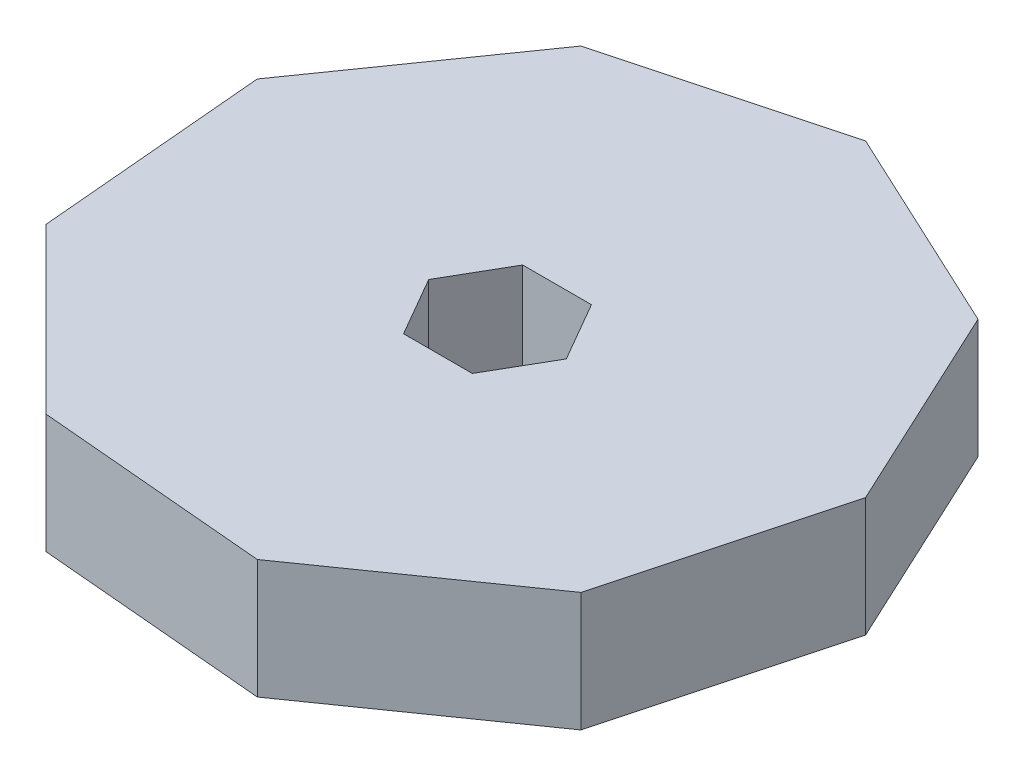
ISO-10303-21;
HEADER;
FILE_DESCRIPTION(('STEP AP214'),'2;1');
FILE_NAME('part.step','',(''),(''),'','','');
FILE_SCHEMA(('AUTOMOTIVE_DESIGN { 1 0 10303 214 1 1 1 1 }'));
ENDSEC;
DATA;
#1=APPLICATION_CONTEXT('core data for automotive mechanical design processes');
#2=APPLICATION_PROTOCOL_DEFINITION('international standard','automotive_design',2000,#1);
#3=PRODUCT_CONTEXT('',#1,'mechanical');
#4=PRODUCT('Part','Part','',(#3));
#5=PRODUCT_RELATED_PRODUCT_CATEGORY('part','',(#4));
#6=PRODUCT_DEFINITION_FORMATION('','',#4);
#7=PRODUCT_DEFINITION_CONTEXT('part definition',#1,'design');
#8=PRODUCT_DEFINITION('design','',#6,#7);
#9=PRODUCT_DEFINITION_SHAPE('','',#8);
#10=(LENGTH_UNIT() NAMED_UNIT(*) SI_UNIT(.MILLI.,.METRE.));
#11=(NAMED_UNIT(*) PLANE_ANGLE_UNIT() SI_UNIT($,.RADIAN.));
#12=(NAMED_UNIT(*) SI_UNIT($,.STERADIAN.) SOLID_ANGLE_UNIT());
#13=UNCERTAINTY_MEASURE_WITH_UNIT(LENGTH_MEASURE(1.E-05),#10,'distance_accuracy_value','');
#14=(GEOMETRIC_REPRESENTATION_CONTEXT(3) GLOBAL_UNCERTAINTY_ASSIGNED_CONTEXT((#13)) GLOBAL_UNIT_ASSIGNED_CONTEXT((#10,
#11,#12)) REPRESENTATION_CONTEXT('',''));
#15=CARTESIAN_POINT('',(0.,0.,0.));
#16=DIRECTION('',(0.,0.,1.));
#17=DIRECTION('',(1.,0.,0.));
#18=AXIS2_PLACEMENT_3D('',#15,#16,#17);
#19=CARTESIAN_POINT('',(4.68725880370433,6.35,17.4930880036489));
#20=DIRECTION('',(-0.573576436351048,0.,-0.819152044288991));
#21=DIRECTION('',(-0.819152044288991,0.,0.573576436351048));
#22=AXIS2_PLACEMENT_3D('',#19,#20,#21);
#23=PLANE('',#22);
#24=DIRECTION('',(0.81915204428899,0.,-0.573576436351048));
#25=VECTOR('',#24,1.);
#26=CARTESIAN_POINT('',(4.68725880370433,0.,17.4930880036489));
#27=LINE('',#26,#25);
#28=CARTESIAN_POINT('',(4.68725880370433,0.,17.4930880036489));
#29=VERTEX_POINT('',#28);
#30=CARTESIAN_POINT('',(14.83498878394,0.,10.3875709757712));
#31=VERTEX_POINT('',#30);
#32=EDGE_CURVE('E194',#29,#31,#27,.T.);
#33=ORIENTED_EDGE('',*,*,#32,.T.);
#34=DIRECTION('',(0.,-1.,0.));
#35=VECTOR('',#34,1.);
#36=CARTESIAN_POINT('',(14.83498878394,6.35,10.3875709757712));
#37=LINE('',#36,#35);
#38=CARTESIAN_POINT('',(14.83498878394,6.35,10.3875709757712));
#39=VERTEX_POINT('',#38);
#40=EDGE_CURVE('E11',#39,#31,#37,.T.);
#41=ORIENTED_EDGE('',*,*,#40,.F.);
#42=DIRECTION('',(0.81915204428899,0.,-0.573576436351048));
#43=VECTOR('',#42,1.);
#44=CARTESIAN_POINT('',(4.68725880370433,6.35,17.4930880036489));
#45=LINE('',#44,#43);
#46=CARTESIAN_POINT('',(4.68725880370433,6.35,17.4930880036489));
#47=VERTEX_POINT('',#46);
#48=EDGE_CURVE('E202',#47,#39,#45,.T.);
#49=ORIENTED_EDGE('',*,*,#48,.F.);
#50=DIRECTION('',(0.,-1.,0.));
#51=VECTOR('',#50,1.);
#52=CARTESIAN_POINT('',(4.68725880370433,6.35,17.4930880036489));
#53=LINE('',#52,#51);
#54=EDGE_CURVE('E222',#47,#29,#53,.T.);
#55=ORIENTED_EDGE('',*,*,#54,.T.);
#56=EDGE_LOOP('',(#33,#41,#49,#55));
#57=FACE_BOUND('',#56,.T.);
#58=ADVANCED_FACE('F43',(#57),#23,.F.);
#59=CARTESIAN_POINT('',(14.83498878394,6.35,10.3875709757712));
#60=DIRECTION('',(-0.965925826289069,0.,-0.258819045102519));
#61=DIRECTION('',(-0.258819045102519,0.,0.965925826289069));
#62=AXIS2_PLACEMENT_3D('',#59,#60,#61);
#63=PLANE('',#62);
#64=DIRECTION('',(0.258819045102519,0.,-0.965925826289069));
#65=VECTOR('',#64,1.);
#66=CARTESIAN_POINT('',(14.83498878394,0.,10.3875709757712));
#67=LINE('',#66,#65);
#68=CARTESIAN_POINT('',(18.0412626396348,0.,-1.57840595666188));
#69=VERTEX_POINT('',#68);
#70=EDGE_CURVE('E225',#31,#69,#67,.T.);
#71=ORIENTED_EDGE('',*,*,#70,.T.);
#72=DIRECTION('',(0.,-1.,0.));
#73=VECTOR('',#72,1.);
#74=CARTESIAN_POINT('',(18.0412626396348,6.35,-1.57840595666188));
#75=LINE('',#74,#73);
#76=CARTESIAN_POINT('',(18.0412626396348,6.35,-1.57840595666188));
#77=VERTEX_POINT('',#76);
#78=EDGE_CURVE('E50',#77,#69,#75,.T.);
#79=ORIENTED_EDGE('',*,*,#78,.F.);
#80=DIRECTION('',(0.258819045102519,0.,-0.965925826289069));
#81=VECTOR('',#80,1.);
#82=CARTESIAN_POINT('',(14.83498878394,6.35,10.3875709757712));
#83=LINE('',#82,#81);
#84=EDGE_CURVE('E205',#39,#77,#83,.T.);
#85=ORIENTED_EDGE('',*,*,#84,.F.);
#86=ORIENTED_EDGE('',*,*,#40,.T.);
#87=EDGE_LOOP('',(#71,#79,#85,#86));
#88=FACE_BOUND('',#87,.T.);
#89=ADVANCED_FACE('F285',(#88),#63,.F.);
#90=CARTESIAN_POINT('',(18.0412626396348,6.35,-1.57840595666188));
#91=DIRECTION('',(-0.906307787036649,0.,0.422618261740702));
#92=DIRECTION('',(0.422618261740702,0.,0.906307787036649));
#93=AXIS2_PLACEMENT_3D('',#90,#91,#92);
#94=PLANE('',#93);
#95=DIRECTION('',(-0.422618261740702,0.,-0.906307787036649));
#96=VECTOR('',#95,1.);
#97=CARTESIAN_POINT('',(18.0412626396348,0.,-1.57840595666188));
#98=LINE('',#97,#96);
#99=CARTESIAN_POINT('',(12.8058291999446,0.,-12.8058291999446));
#100=VERTEX_POINT('',#99);
#101=EDGE_CURVE('E227',#69,#100,#98,.T.);
#102=ORIENTED_EDGE('',*,*,#101,.T.);
#103=DIRECTION('',(0.,-1.,0.));
#104=VECTOR('',#103,1.);
#105=CARTESIAN_POINT('',(12.8058291999446,6.35,-12.8058291999446));
#106=LINE('',#105,#104);
#107=CARTESIAN_POINT('',(12.8058291999446,6.35,-12.8058291999446));
#108=VERTEX_POINT('',#107);
#109=EDGE_CURVE('E257',#108,#100,#106,.T.);
#110=ORIENTED_EDGE('',*,*,#109,.F.);
#111=DIRECTION('',(-0.422618261740702,0.,-0.906307787036649));
#112=VECTOR('',#111,1.);
#113=CARTESIAN_POINT('',(18.0412626396348,6.35,-1.57840595666188));
#114=LINE('',#113,#112);
#115=EDGE_CURVE('E208',#77,#108,#114,.T.);
#116=ORIENTED_EDGE('',*,*,#115,.F.);
#117=ORIENTED_EDGE('',*,*,#78,.T.);
#118=EDGE_LOOP('',(#102,#110,#116,#117));
#119=FACE_BOUND('',#118,.T.);
#120=ADVANCED_FACE('F264',(#119),#94,.F.);
#121=CARTESIAN_POINT('',(12.8058291999446,6.35,-12.8058291999446));
#122=DIRECTION('',(-0.422618261740697,0.,0.906307787036651));
#123=DIRECTION('',(0.906307787036651,0.,0.422618261740697));
#124=AXIS2_PLACEMENT_3D('',#121,#122,#123);
#125=PLANE('',#124);
#126=DIRECTION('',(-0.906307787036651,0.,-0.422618261740697));
#127=VECTOR('',#126,1.);
#128=CARTESIAN_POINT('',(12.8058291999446,0.,-12.8058291999446));
#129=LINE('',#128,#127);
#130=CARTESIAN_POINT('',(1.57840595666179,0.,-18.0412626396348));
#131=VERTEX_POINT('',#130);
#132=EDGE_CURVE('E229',#100,#131,#129,.T.);
#133=ORIENTED_EDGE('',*,*,#132,.T.);
#134=DIRECTION('',(0.,-1.,0.));
#135=VECTOR('',#134,1.);
#136=CARTESIAN_POINT('',(1.57840595666179,6.35,-18.0412626396348));
#137=LINE('',#136,#135);
#138=CARTESIAN_POINT('',(1.57840595666179,6.35,-18.0412626396348));
#139=VERTEX_POINT('',#138);
#140=EDGE_CURVE('E254',#139,#131,#137,.T.);
#141=ORIENTED_EDGE('',*,*,#140,.F.);
#142=DIRECTION('',(-0.906307787036651,0.,-0.422618261740697));
#143=VECTOR('',#142,1.);
#144=CARTESIAN_POINT('',(12.8058291999446,6.35,-12.8058291999446));
#145=LINE('',#144,#143);
#146=EDGE_CURVE('E210',#108,#139,#145,.T.);
#147=ORIENTED_EDGE('',*,*,#146,.F.);
#148=ORIENTED_EDGE('',*,*,#109,.T.);
#149=EDGE_LOOP('',(#133,#141,#147,#148));
#150=FACE_BOUND('',#149,.T.);
#151=ADVANCED_FACE('F273',(#150),#125,.F.);
#152=CARTESIAN_POINT('',(1.57840595666179,6.35,-18.0412626396348));
#153=DIRECTION('',(0.258819045102523,0.,0.965925826289068));
#154=DIRECTION('',(0.965925826289068,0.,-0.258819045102523));
#155=AXIS2_PLACEMENT_3D('',#152,#153,#154);
#156=PLANE('',#155);
#157=DIRECTION('',(-0.965925826289068,0.,0.258819045102523));
#158=VECTOR('',#157,1.);
#159=CARTESIAN_POINT('',(1.57840595666179,0.,-18.0412626396348));
#160=LINE('',#159,#158);
#161=CARTESIAN_POINT('',(-10.3875709757713,0.,-14.8349887839399));
#162=VERTEX_POINT('',#161);
#163=EDGE_CURVE('E231',#131,#162,#160,.T.);
#164=ORIENTED_EDGE('',*,*,#163,.T.);
#165=DIRECTION('',(0.,-1.,0.));
#166=VECTOR('',#165,1.);
#167=CARTESIAN_POINT('',(-10.3875709757713,6.35,-14.8349887839399));
#168=LINE('',#167,#166);
#169=CARTESIAN_POINT('',(-10.3875709757713,6.35,-14.8349887839399));
#170=VERTEX_POINT('',#169);
#171=EDGE_CURVE('E251',#170,#162,#168,.T.);
#172=ORIENTED_EDGE('',*,*,#171,.F.);
#173=DIRECTION('',(-0.965925826289068,0.,0.258819045102523));
#174=VECTOR('',#173,1.);
#175=CARTESIAN_POINT('',(1.57840595666179,6.35,-18.0412626396348));
#176=LINE('',#175,#174);
#177=EDGE_CURVE('E212',#139,#170,#176,.T.);
#178=ORIENTED_EDGE('',*,*,#177,.F.);
#179=ORIENTED_EDGE('',*,*,#140,.T.);
#180=EDGE_LOOP('',(#164,#172,#178,#179));
#181=FACE_BOUND('',#180,.T.);
#182=ADVANCED_FACE('F277',(#181),#156,.F.);
#183=CARTESIAN_POINT('',(-10.3875709757713,6.35,-14.8349887839399));
#184=DIRECTION('',(0.819152044288993,0.,0.573576436351044));
#185=DIRECTION('',(0.573576436351044,0.,-0.819152044288993));
#186=AXIS2_PLACEMENT_3D('',#183,#184,#185);
#187=PLANE('',#186);
#188=DIRECTION('',(-0.573576436351044,0.,0.819152044288993));
#189=VECTOR('',#188,1.);
#190=CARTESIAN_POINT('',(-10.3875709757713,0.,-14.8349887839399));
#191=LINE('',#190,#189);
#192=CARTESIAN_POINT('',(-17.4930880036489,0.,-4.68725880370425));
#193=VERTEX_POINT('',#192);
#194=EDGE_CURVE('E233',#162,#193,#191,.T.);
#195=ORIENTED_EDGE('',*,*,#194,.T.);
#196=DIRECTION('',(0.,-1.,0.));
#197=VECTOR('',#196,1.);
#198=CARTESIAN_POINT('',(-17.4930880036489,6.35,-4.68725880370425));
#199=LINE('',#198,#197);
#200=CARTESIAN_POINT('',(-17.4930880036489,6.35,-4.68725880370425));
#201=VERTEX_POINT('',#200);
#202=EDGE_CURVE('E248',#201,#193,#199,.T.);
#203=ORIENTED_EDGE('',*,*,#202,.F.);
#204=DIRECTION('',(-0.573576436351044,0.,0.819152044288993));
#205=VECTOR('',#204,1.);
#206=CARTESIAN_POINT('',(-10.3875709757713,6.35,-14.8349887839399));
#207=LINE('',#206,#205);
#208=EDGE_CURVE('E214',#170,#201,#207,.T.);
#209=ORIENTED_EDGE('',*,*,#208,.F.);
#210=ORIENTED_EDGE('',*,*,#171,.T.);
#211=EDGE_LOOP('',(#195,#203,#209,#210));
#212=FACE_BOUND('',#211,.T.);
#213=ADVANCED_FACE('F303',(#212),#187,.F.);
#214=CARTESIAN_POINT('',(-17.4930880036489,6.35,-4.68725880370425));
#215=DIRECTION('',(0.996194698091745,0.,-0.0871557427476612));
#216=DIRECTION('',(-0.0871557427476612,0.,-0.996194698091745));
#217=AXIS2_PLACEMENT_3D('',#214,#215,#216);
#218=PLANE('',#217);
#219=DIRECTION('',(0.0871557427476612,0.,0.996194698091745));
#220=VECTOR('',#219,1.);
#221=CARTESIAN_POINT('',(-17.4930880036489,0.,-4.68725880370425));
#222=LINE('',#221,#220);
#223=CARTESIAN_POINT('',(-16.4133947406017,0.,7.65369166386362));
#224=VERTEX_POINT('',#223);
#225=EDGE_CURVE('E235',#193,#224,#222,.T.);
#226=ORIENTED_EDGE('',*,*,#225,.T.);
#227=DIRECTION('',(0.,-1.,0.));
#228=VECTOR('',#227,1.);
#229=CARTESIAN_POINT('',(-16.4133947406017,6.35,7.65369166386362));
#230=LINE('',#229,#228);
#231=CARTESIAN_POINT('',(-16.4133947406017,6.35,7.65369166386362));
#232=VERTEX_POINT('',#231);
#233=EDGE_CURVE('E245',#232,#224,#230,.T.);
#234=ORIENTED_EDGE('',*,*,#233,.F.);
#235=DIRECTION('',(0.0871557427476612,0.,0.996194698091745));
#236=VECTOR('',#235,1.);
#237=CARTESIAN_POINT('',(-17.4930880036489,6.35,-4.68725880370425));
#238=LINE('',#237,#236);
#239=EDGE_CURVE('E216',#201,#232,#238,.T.);
#240=ORIENTED_EDGE('',*,*,#239,.F.);
#241=ORIENTED_EDGE('',*,*,#202,.T.);
#242=EDGE_LOOP('',(#226,#234,#240,#241));
#243=FACE_BOUND('',#242,.T.);
#244=ADVANCED_FACE('F301',(#243),#218,.F.);
#245=CARTESIAN_POINT('',(-16.4133947406017,6.35,7.65369166386362));
#246=DIRECTION('',(0.707106781186546,0.,-0.707106781186549));
#247=DIRECTION('',(-0.707106781186549,0.,-0.707106781186546));
#248=AXIS2_PLACEMENT_3D('',#245,#246,#247);
#249=PLANE('',#248);
#250=DIRECTION('',(0.707106781186549,0.,0.707106781186546));
#251=VECTOR('',#250,1.);
#252=CARTESIAN_POINT('',(-16.4133947406017,0.,7.65369166386362));
#253=LINE('',#252,#251);
#254=CARTESIAN_POINT('',(-7.65369166386353,0.,16.4133947406018));
#255=VERTEX_POINT('',#254);
#256=EDGE_CURVE('E237',#224,#255,#253,.T.);
#257=ORIENTED_EDGE('',*,*,#256,.T.);
#258=DIRECTION('',(0.,-1.,0.));
#259=VECTOR('',#258,1.);
#260=CARTESIAN_POINT('',(-7.65369166386353,6.35,16.4133947406018));
#261=LINE('',#260,#259);
#262=CARTESIAN_POINT('',(-7.65369166386353,6.35,16.4133947406018));
#263=VERTEX_POINT('',#262);
#264=EDGE_CURVE('E242',#263,#255,#261,.T.);
#265=ORIENTED_EDGE('',*,*,#264,.F.);
#266=DIRECTION('',(0.707106781186549,0.,0.707106781186546));
#267=VECTOR('',#266,1.);
#268=CARTESIAN_POINT('',(-16.4133947406017,6.35,7.65369166386362));
#269=LINE('',#268,#267);
#270=EDGE_CURVE('E218',#232,#263,#269,.T.);
#271=ORIENTED_EDGE('',*,*,#270,.F.);
#272=ORIENTED_EDGE('',*,*,#233,.T.);
#273=EDGE_LOOP('',(#257,#265,#271,#272));
#274=FACE_BOUND('',#273,.T.);
#275=ADVANCED_FACE('F297',(#274),#249,.F.);
#276=CARTESIAN_POINT('',(-7.65369166386353,6.35,16.4133947406018));
#277=DIRECTION('',(0.0871557427476557,0.,-0.996194698091746));
#278=DIRECTION('',(-0.996194698091746,0.,-0.0871557427476558));
#279=AXIS2_PLACEMENT_3D('',#276,#277,#278);
#280=PLANE('',#279);
#281=DIRECTION('',(0.996194698091746,0.,0.0871557427476557));
#282=VECTOR('',#281,1.);
#283=CARTESIAN_POINT('',(-7.65369166386353,0.,16.4133947406018));
#284=LINE('',#283,#282);
#285=EDGE_CURVE('E206',#255,#29,#284,.T.);
#286=ORIENTED_EDGE('',*,*,#285,.T.);
#287=ORIENTED_EDGE('',*,*,#54,.F.);
#288=DIRECTION('',(0.996194698091746,0.,0.0871557427476557));
#289=VECTOR('',#288,1.);
#290=CARTESIAN_POINT('',(-7.65369166386353,6.35,16.4133947406018));
#291=LINE('',#290,#289);
#292=EDGE_CURVE('E220',#263,#47,#291,.T.);
#293=ORIENTED_EDGE('',*,*,#292,.F.);
#294=ORIENTED_EDGE('',*,*,#264,.T.);
#295=EDGE_LOOP('',(#286,#287,#293,#294));
#296=FACE_BOUND('',#295,.T.);
#297=ADVANCED_FACE('F292',(#296),#280,.F.);
#298=CARTESIAN_POINT('',(0.,6.35,0.));
#299=DIRECTION('',(0.,1.,0.));
#300=DIRECTION('',(0.,0.,1.));
#301=AXIS2_PLACEMENT_3D('',#298,#299,#300);
#302=PLANE('',#301);
#303=DIRECTION('',(-0.5,0.,-0.866025403784439));
#304=VECTOR('',#303,1.);
#305=CARTESIAN_POINT('',(3.66617420935412,6.35,0.));
#306=LINE('',#305,#304);
#307=CARTESIAN_POINT('',(3.66617420935412,6.35,0.));
#308=VERTEX_POINT('',#307);
#309=CARTESIAN_POINT('',(1.83308710467706,6.35,-3.175));
#310=VERTEX_POINT('',#309);
#311=EDGE_CURVE('E57',#308,#310,#306,.T.);
#312=ORIENTED_EDGE('',*,*,#311,.F.);
#313=DIRECTION('',(0.5,0.,-0.866025403784439));
#314=VECTOR('',#313,1.);
#315=CARTESIAN_POINT('',(1.83308710467706,6.35,3.175));
#316=LINE('',#315,#314);
#317=CARTESIAN_POINT('',(1.83308710467706,6.35,3.175));
#318=VERTEX_POINT('',#317);
#319=EDGE_CURVE('E168',#318,#308,#316,.T.);
#320=ORIENTED_EDGE('',*,*,#319,.F.);
#321=DIRECTION('',(1.,0.,0.));
#322=VECTOR('',#321,1.);
#323=CARTESIAN_POINT('',(-1.83308710467706,6.35,3.175));
#324=LINE('',#323,#322);
#325=CARTESIAN_POINT('',(-1.83308710467706,6.35,3.175));
#326=VERTEX_POINT('',#325);
#327=EDGE_CURVE('E171',#326,#318,#324,.T.);
#328=ORIENTED_EDGE('',*,*,#327,.F.);
#329=DIRECTION('',(0.5,0.,0.866025403784439));
#330=VECTOR('',#329,1.);
#331=CARTESIAN_POINT('',(-3.66617420935412,6.35,0.));
#332=LINE('',#331,#330);
#333=CARTESIAN_POINT('',(-3.66617420935412,6.35,0.));
#334=VERTEX_POINT('',#333);
#335=EDGE_CURVE('E187',#334,#326,#332,.T.);
#336=ORIENTED_EDGE('',*,*,#335,.F.);
#337=DIRECTION('',(-0.5,0.,0.866025403784438));
#338=VECTOR('',#337,1.);
#339=CARTESIAN_POINT('',(-1.83308710467706,6.35,-3.175));
#340=LINE('',#339,#338);
#341=CARTESIAN_POINT('',(-1.83308710467706,6.35,-3.175));
#342=VERTEX_POINT('',#341);
#343=EDGE_CURVE('E184',#342,#334,#340,.T.);
#344=ORIENTED_EDGE('',*,*,#343,.F.);
#345=DIRECTION('',(-1.,0.,0.));
#346=VECTOR('',#345,1.);
#347=CARTESIAN_POINT('',(1.83308710467706,6.35,-3.175));
#348=LINE('',#347,#346);
#349=EDGE_CURVE('E182',#310,#342,#348,.T.);
#350=ORIENTED_EDGE('',*,*,#349,.F.);
#351=EDGE_LOOP('',(#312,#320,#328,#336,#344,#350));
#352=FACE_BOUND('',#351,.T.);
#353=ORIENTED_EDGE('',*,*,#48,.T.);
#354=ORIENTED_EDGE('',*,*,#84,.T.);
#355=ORIENTED_EDGE('',*,*,#115,.T.);
#356=ORIENTED_EDGE('',*,*,#146,.T.);
#357=ORIENTED_EDGE('',*,*,#177,.T.);
#358=ORIENTED_EDGE('',*,*,#208,.T.);
#359=ORIENTED_EDGE('',*,*,#239,.T.);
#360=ORIENTED_EDGE('',*,*,#270,.T.);
#361=ORIENTED_EDGE('',*,*,#292,.T.);
#362=EDGE_LOOP('',(#353,#354,#355,#356,#357,#358,#359,#360,#361));
#363=FACE_BOUND('',#362,.T.);
#364=ADVANCED_FACE('F281',(#352,#363),#302,.T.);
#365=CARTESIAN_POINT('',(0.,0.,0.));
#366=DIRECTION('',(0.,1.,0.));
#367=DIRECTION('',(0.,0.,1.));
#368=AXIS2_PLACEMENT_3D('',#365,#366,#367);
#369=PLANE('',#368);
#370=DIRECTION('',(0.5,0.,-0.866025403784439));
#371=VECTOR('',#370,1.);
#372=CARTESIAN_POINT('',(1.83308710467706,0.,3.175));
#373=LINE('',#372,#371);
#374=CARTESIAN_POINT('',(1.83308710467706,0.,3.175));
#375=VERTEX_POINT('',#374);
#376=CARTESIAN_POINT('',(3.66617420935412,0.,0.));
#377=VERTEX_POINT('',#376);
#378=EDGE_CURVE('E157',#375,#377,#373,.T.);
#379=ORIENTED_EDGE('',*,*,#378,.T.);
#380=DIRECTION('',(-0.5,0.,-0.866025403784439));
#381=VECTOR('',#380,1.);
#382=CARTESIAN_POINT('',(3.66617420935412,0.,0.));
#383=LINE('',#382,#381);
#384=CARTESIAN_POINT('',(1.83308710467706,0.,-3.175));
#385=VERTEX_POINT('',#384);
#386=EDGE_CURVE('E151',#377,#385,#383,.T.);
#387=ORIENTED_EDGE('',*,*,#386,.T.);
#388=DIRECTION('',(-1.,0.,0.));
#389=VECTOR('',#388,1.);
#390=CARTESIAN_POINT('',(1.83308710467706,0.,-3.175));
#391=LINE('',#390,#389);
#392=CARTESIAN_POINT('',(-1.83308710467706,0.,-3.175));
#393=VERTEX_POINT('',#392);
#394=EDGE_CURVE('E160',#385,#393,#391,.T.);
#395=ORIENTED_EDGE('',*,*,#394,.T.);
#396=DIRECTION('',(-0.5,0.,0.866025403784438));
#397=VECTOR('',#396,1.);
#398=CARTESIAN_POINT('',(-1.83308710467706,0.,-3.175));
#399=LINE('',#398,#397);
#400=CARTESIAN_POINT('',(-3.66617420935412,0.,0.));
#401=VERTEX_POINT('',#400);
#402=EDGE_CURVE('E65',#393,#401,#399,.T.);
#403=ORIENTED_EDGE('',*,*,#402,.T.);
#404=DIRECTION('',(0.5,0.,0.866025403784439));
#405=VECTOR('',#404,1.);
#406=CARTESIAN_POINT('',(-3.66617420935412,0.,0.));
#407=LINE('',#406,#405);
#408=CARTESIAN_POINT('',(-1.83308710467706,0.,3.175));
#409=VERTEX_POINT('',#408);
#410=EDGE_CURVE('E175',#401,#409,#407,.T.);
#411=ORIENTED_EDGE('',*,*,#410,.T.);
#412=DIRECTION('',(1.,0.,0.));
#413=VECTOR('',#412,1.);
#414=CARTESIAN_POINT('',(-1.83308710467706,0.,3.175));
#415=LINE('',#414,#413);
#416=EDGE_CURVE('E178',#409,#375,#415,.T.);
#417=ORIENTED_EDGE('',*,*,#416,.T.);
#418=EDGE_LOOP('',(#379,#387,#395,#403,#411,#417));
#419=FACE_BOUND('',#418,.T.);
#420=ORIENTED_EDGE('',*,*,#32,.F.);
#421=ORIENTED_EDGE('',*,*,#285,.F.);
#422=ORIENTED_EDGE('',*,*,#256,.F.);
#423=ORIENTED_EDGE('',*,*,#225,.F.);
#424=ORIENTED_EDGE('',*,*,#194,.F.);
#425=ORIENTED_EDGE('',*,*,#163,.F.);
#426=ORIENTED_EDGE('',*,*,#132,.F.);
#427=ORIENTED_EDGE('',*,*,#101,.F.);
#428=ORIENTED_EDGE('',*,*,#70,.F.);
#429=EDGE_LOOP('',(#420,#421,#422,#423,#424,#425,#426,#427,#428));
#430=FACE_BOUND('',#429,.T.);
#431=ADVANCED_FACE('F164',(#419,#430),#369,.F.);
#432=CARTESIAN_POINT('',(3.66617420935412,0.,0.));
#433=DIRECTION('',(0.866025403784439,0.,-0.5));
#434=DIRECTION('',(-0.5,0.,-0.866025403784439));
#435=AXIS2_PLACEMENT_3D('',#432,#433,#434);
#436=PLANE('',#435);
#437=ORIENTED_EDGE('',*,*,#311,.T.);
#438=DIRECTION('',(0.,1.,0.));
#439=VECTOR('',#438,1.);
#440=CARTESIAN_POINT('',(1.83308710467706,0.,-3.175));
#441=LINE('',#440,#439);
#442=EDGE_CURVE('E147',#385,#310,#441,.T.);
#443=ORIENTED_EDGE('',*,*,#442,.F.);
#444=ORIENTED_EDGE('',*,*,#386,.F.);
#445=DIRECTION('',(0.,1.,0.));
#446=VECTOR('',#445,1.);
#447=CARTESIAN_POINT('',(3.66617420935412,0.,0.));
#448=LINE('',#447,#446);
#449=EDGE_CURVE('E192',#377,#308,#448,.T.);
#450=ORIENTED_EDGE('',*,*,#449,.T.);
#451=EDGE_LOOP('',(#437,#443,#444,#450));
#452=FACE_BOUND('',#451,.T.);
#453=ADVANCED_FACE('F149',(#452),#436,.F.);
#454=CARTESIAN_POINT('',(1.83308710467706,0.,3.175));
#455=DIRECTION('',(0.866025403784438,0.,0.5));
#456=DIRECTION('',(0.5,0.,-0.866025403784439));
#457=AXIS2_PLACEMENT_3D('',#454,#455,#456);
#458=PLANE('',#457);
#459=ORIENTED_EDGE('',*,*,#319,.T.);
#460=ORIENTED_EDGE('',*,*,#449,.F.);
#461=ORIENTED_EDGE('',*,*,#378,.F.);
#462=DIRECTION('',(0.,1.,0.));
#463=VECTOR('',#462,1.);
#464=CARTESIAN_POINT('',(1.83308710467706,0.,3.175));
#465=LINE('',#464,#463);
#466=EDGE_CURVE('E195',#375,#318,#465,.T.);
#467=ORIENTED_EDGE('',*,*,#466,.T.);
#468=EDGE_LOOP('',(#459,#460,#461,#467));
#469=FACE_BOUND('',#468,.T.);
#470=ADVANCED_FACE('F384',(#469),#458,.F.);
#471=CARTESIAN_POINT('',(-1.83308710467706,0.,3.175));
#472=DIRECTION('',(0.,0.,1.));
#473=DIRECTION('',(1.,0.,0.));
#474=AXIS2_PLACEMENT_3D('',#471,#472,#473);
#475=PLANE('',#474);
#476=ORIENTED_EDGE('',*,*,#327,.T.);
#477=ORIENTED_EDGE('',*,*,#466,.F.);
#478=ORIENTED_EDGE('',*,*,#416,.F.);
#479=DIRECTION('',(0.,1.,0.));
#480=VECTOR('',#479,1.);
#481=CARTESIAN_POINT('',(-1.83308710467706,0.,3.175));
#482=LINE('',#481,#480);
#483=EDGE_CURVE('E197',#409,#326,#482,.T.);
#484=ORIENTED_EDGE('',*,*,#483,.T.);
#485=EDGE_LOOP('',(#476,#477,#478,#484));
#486=FACE_BOUND('',#485,.T.);
#487=ADVANCED_FACE('F393',(#486),#475,.F.);
#488=CARTESIAN_POINT('',(-3.66617420935412,0.,0.));
#489=DIRECTION('',(-0.866025403784439,0.,0.5));
#490=DIRECTION('',(0.5,0.,0.866025403784439));
#491=AXIS2_PLACEMENT_3D('',#488,#489,#490);
#492=PLANE('',#491);
#493=ORIENTED_EDGE('',*,*,#335,.T.);
#494=ORIENTED_EDGE('',*,*,#483,.F.);
#495=ORIENTED_EDGE('',*,*,#410,.F.);
#496=DIRECTION('',(0.,1.,0.));
#497=VECTOR('',#496,1.);
#498=CARTESIAN_POINT('',(-3.66617420935412,0.,0.));
#499=LINE('',#498,#497);
#500=EDGE_CURVE('E199',#401,#334,#499,.T.);
#501=ORIENTED_EDGE('',*,*,#500,.T.);
#502=EDGE_LOOP('',(#493,#494,#495,#501));
#503=FACE_BOUND('',#502,.T.);
#504=ADVANCED_FACE('F403',(#503),#492,.F.);
#505=CARTESIAN_POINT('',(-1.83308710467706,0.,-3.175));
#506=DIRECTION('',(-0.866025403784439,0.,-0.5));
#507=DIRECTION('',(-0.5,0.,0.866025403784439));
#508=AXIS2_PLACEMENT_3D('',#505,#506,#507);
#509=PLANE('',#508);
#510=ORIENTED_EDGE('',*,*,#343,.T.);
#511=ORIENTED_EDGE('',*,*,#500,.F.);
#512=ORIENTED_EDGE('',*,*,#402,.F.);
#513=DIRECTION('',(0.,1.,0.));
#514=VECTOR('',#513,1.);
#515=CARTESIAN_POINT('',(-1.83308710467706,0.,-3.175));
#516=LINE('',#515,#514);
#517=EDGE_CURVE('E156',#393,#342,#516,.T.);
#518=ORIENTED_EDGE('',*,*,#517,.T.);
#519=EDGE_LOOP('',(#510,#511,#512,#518));
#520=FACE_BOUND('',#519,.T.);
#521=ADVANCED_FACE('F413',(#520),#509,.F.);
#522=CARTESIAN_POINT('',(1.83308710467706,0.,-3.175));
#523=DIRECTION('',(0.,0.,-1.));
#524=DIRECTION('',(-1.,0.,0.));
#525=AXIS2_PLACEMENT_3D('',#522,#523,#524);
#526=PLANE('',#525);
#527=ORIENTED_EDGE('',*,*,#349,.T.);
#528=ORIENTED_EDGE('',*,*,#517,.F.);
#529=ORIENTED_EDGE('',*,*,#394,.F.);
#530=ORIENTED_EDGE('',*,*,#442,.T.);
#531=EDGE_LOOP('',(#527,#528,#529,#530));
#532=FACE_BOUND('',#531,.T.);
#533=ADVANCED_FACE('F161',(#532),#526,.F.);
#534=CLOSED_SHELL('',(#58,#89,#120,#151,#182,#213,#244,#275,#297,#364,#431,#453,#470,#487,#504,
#521,#533));
#535=MANIFOLD_SOLID_BREP('B2',#534);
#536=ADVANCED_BREP_SHAPE_REPRESENTATION('',(#18,#535),#14);
#537=SHAPE_DEFINITION_REPRESENTATION(#9,#536);
ENDSEC;
END-ISO-10303-21;
